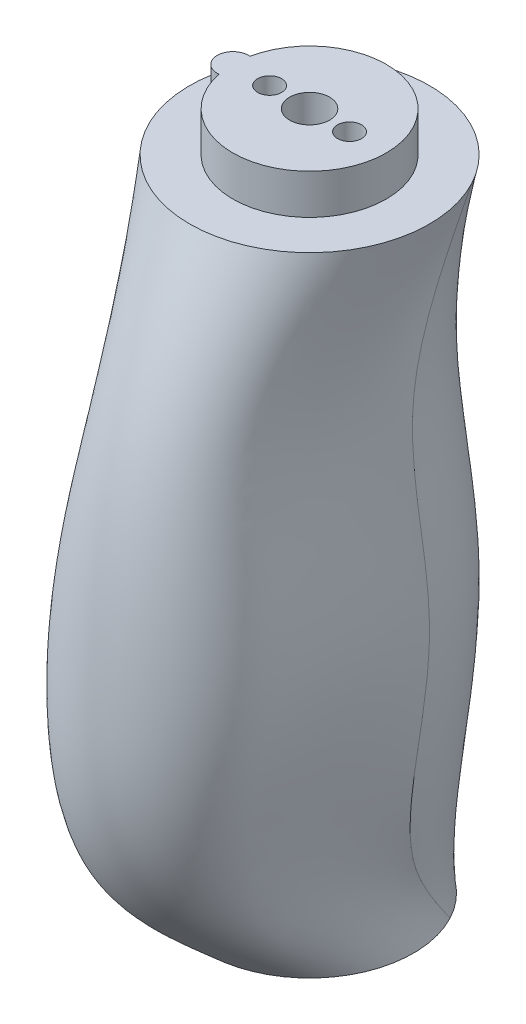
ISO-10303-21;
HEADER;
FILE_DESCRIPTION(('STEP AP214'),'2;1');
FILE_NAME('part.step','',(''),(''),'','','');
FILE_SCHEMA(('AUTOMOTIVE_DESIGN { 1 0 10303 214 1 1 1 1 }'));
ENDSEC;
DATA;
#1=APPLICATION_CONTEXT('core data for automotive mechanical design processes');
#2=APPLICATION_PROTOCOL_DEFINITION('international standard','automotive_design',2000,#1);
#3=PRODUCT_CONTEXT('',#1,'mechanical');
#4=PRODUCT('Part','Part','',(#3));
#5=PRODUCT_RELATED_PRODUCT_CATEGORY('part','',(#4));
#6=PRODUCT_DEFINITION_FORMATION('','',#4);
#7=PRODUCT_DEFINITION_CONTEXT('part definition',#1,'design');
#8=PRODUCT_DEFINITION('design','',#6,#7);
#9=PRODUCT_DEFINITION_SHAPE('','',#8);
#10=(LENGTH_UNIT() NAMED_UNIT(*) SI_UNIT(.MILLI.,.METRE.));
#11=(NAMED_UNIT(*) PLANE_ANGLE_UNIT() SI_UNIT($,.RADIAN.));
#12=(NAMED_UNIT(*) SI_UNIT($,.STERADIAN.) SOLID_ANGLE_UNIT());
#13=UNCERTAINTY_MEASURE_WITH_UNIT(LENGTH_MEASURE(1.E-05),#10,'distance_accuracy_value','');
#14=(GEOMETRIC_REPRESENTATION_CONTEXT(3) GLOBAL_UNCERTAINTY_ASSIGNED_CONTEXT((#13)) GLOBAL_UNIT_ASSIGNED_CONTEXT((#10,
#11,#12)) REPRESENTATION_CONTEXT('',''));
#15=CARTESIAN_POINT('',(0.,0.,0.));
#16=DIRECTION('',(0.,0.,1.));
#17=DIRECTION('',(1.,0.,0.));
#18=AXIS2_PLACEMENT_3D('',#15,#16,#17);
#19=CARTESIAN_POINT('',(0.,45.,0.));
#20=DIRECTION('',(0.,1.,0.));
#21=DIRECTION('',(0.,0.,1.));
#22=AXIS2_PLACEMENT_3D('',#19,#20,#21);
#23=PLANE('',#22);
#24=CARTESIAN_POINT('',(0.,45.,0.));
#25=DIRECTION('',(0.,1.,0.));
#26=DIRECTION('',(0.,0.,1.));
#27=AXIS2_PLACEMENT_3D('',#24,#25,#26);
#28=CIRCLE('',#27,9.6);
#29=CARTESIAN_POINT('',(-9.401953125,45.,1.93991686298736));
#30=VERTEX_POINT('',#29);
#31=CARTESIAN_POINT('',(-9.401953125,45.,-1.93991686298737));
#32=VERTEX_POINT('',#31);
#33=EDGE_CURVE('E187',#30,#32,#28,.T.);
#34=ORIENTED_EDGE('',*,*,#33,.F.);
#35=CARTESIAN_POINT('',(-9.6,45.,0.));
#36=DIRECTION('',(0.,1.,0.));
#37=DIRECTION('',(0.,0.,1.));
#38=AXIS2_PLACEMENT_3D('',#35,#36,#37);
#39=CIRCLE('',#38,1.95);
#40=EDGE_CURVE('E144',#32,#30,#39,.T.);
#41=ORIENTED_EDGE('',*,*,#40,.F.);
#42=EDGE_LOOP('',(#34,#41));
#43=FACE_BOUND('',#42,.T.);
#44=CARTESIAN_POINT('',(0.,45.,0.));
#45=DIRECTION('',(0.,1.,0.));
#46=DIRECTION('',(0.,0.,1.));
#47=AXIS2_PLACEMENT_3D('',#44,#45,#46);
#48=CIRCLE('',#47,15.);
#49=CARTESIAN_POINT('',(-13.2531843312214,45.,-7.02517651612167));
#50=VERTEX_POINT('',#49);
#51=CARTESIAN_POINT('',(13.2531843312214,45.,-7.02517651612168));
#52=VERTEX_POINT('',#51);
#53=EDGE_CURVE('E12',#50,#52,#48,.T.);
#54=ORIENTED_EDGE('',*,*,#53,.T.);
#55=EDGE_CURVE('E137',#52,#50,#48,.T.);
#56=ORIENTED_EDGE('',*,*,#55,.T.);
#57=EDGE_LOOP('',(#54,#56));
#58=FACE_BOUND('',#57,.T.);
#59=ADVANCED_FACE('F127',(#43,#58),#23,.T.);
#60=CARTESIAN_POINT('',(0.,-35.,0.));
#61=DIRECTION('',(0.,1.,0.));
#62=DIRECTION('',(0.,0.,1.));
#63=AXIS2_PLACEMENT_3D('',#60,#61,#62);
#64=PLANE('',#63);
#65=CARTESIAN_POINT('',(0.,-35.,0.));
#66=DIRECTION('',(0.,1.,0.));
#67=DIRECTION('',(0.,0.,1.));
#68=AXIS2_PLACEMENT_3D('',#65,#66,#67);
#69=CIRCLE('',#68,13.);
#70=CARTESIAN_POINT('',(11.4860930870586,-35.,-6.08848631397212));
#71=VERTEX_POINT('',#70);
#72=CARTESIAN_POINT('',(-11.4860930870586,-35.,-6.08848631397211));
#73=VERTEX_POINT('',#72);
#74=EDGE_CURVE('E191',#71,#73,#69,.T.);
#75=ORIENTED_EDGE('',*,*,#74,.F.);
#76=EDGE_CURVE('E188',#73,#71,#69,.T.);
#77=ORIENTED_EDGE('',*,*,#76,.F.);
#78=EDGE_LOOP('',(#75,#77));
#79=FACE_BOUND('',#78,.T.);
#80=ADVANCED_FACE('F216',(#79),#64,.F.);
#81=CARTESIAN_POINT('',(-11.4860930870586,-35.,-6.08848631397211));
#82=CARTESIAN_POINT('',(-11.9888238762296,-31.7784022579128,-3.68120735026925));
#83=CARTESIAN_POINT('',(-13.5455110165498,-21.8028449926401,3.77284218614079));
#84=CARTESIAN_POINT('',(-16.2480426834825,0.316696116781407,-1.95027484900687));
#85=CARTESIAN_POINT('',(-12.2634498571922,23.8453925764327,2.5589909201499));
#86=CARTESIAN_POINT('',(-12.9435296898292,38.3814345691434,-4.02661275139869));
#87=CARTESIAN_POINT('',(-13.2531843312214,45.,-7.02517651612167));
#88=CARTESIAN_POINT('',(-12.0757060436891,-35.,-4.97616562275975));
#89=CARTESIAN_POINT('',(-12.2371371110871,-31.7784022579128,-2.51903239271728));
#90=CARTESIAN_POINT('',(-12.7370023910334,-21.8028449926401,5.08938902019735));
#91=CARTESIAN_POINT('',(-16.3346657911776,0.316696116781407,-0.448570482043597));
#92=CARTESIAN_POINT('',(-11.630892938393,23.8453925764327,3.75867982403654));
#93=CARTESIAN_POINT('',(-13.2130964573224,38.3814345691434,-2.76937087706511));
#94=CARTESIAN_POINT('',(-13.9335069734874,45.,-5.74172956472279));
#95=CARTESIAN_POINT('',(-12.948395240104,-35.,-2.53751404419982));
#96=CARTESIAN_POINT('',(-12.5488443580324,-31.7784022579128,-0.0663093926603867));
#97=CARTESIAN_POINT('',(-11.3116499521554,-21.8028449926401,7.58568365215385));
#98=CARTESIAN_POINT('',(-16.4287996374814,0.316696116781411,2.49746817063417));
#99=CARTESIAN_POINT('',(-10.4940715288381,23.8453925764327,6.07807317078538));
#100=CARTESIAN_POINT('',(-13.5493318211742,38.3814345691434,-0.110234345279721));
#101=CARTESIAN_POINT('',(-14.9404560462738,45.,-2.92790082023056));
#102=CARTESIAN_POINT('',(-13.1202020575421,-35.,1.38058623727581));
#103=CARTESIAN_POINT('',(-12.3291410522181,-31.7784022579128,3.76921133479779));
#104=CARTESIAN_POINT('',(-9.87965015028428,-21.80284499264,11.1654998702377));
#105=CARTESIAN_POINT('',(-16.219428466563,0.316696116781407,6.90927809821799));
#106=CARTESIAN_POINT('',(-9.26650845603646,23.8453925764326,9.45461916506622));
#107=CARTESIAN_POINT('',(-13.3014850385526,38.3814345691434,4.05262541215436));
#108=CARTESIAN_POINT('',(-15.1386946817794,45.0000000000001,1.59298411993362));
#109=CARTESIAN_POINT('',(-12.1526333497857,-35.,5.10186225458553));
#110=CARTESIAN_POINT('',(-11.4198418088333,-31.7784022579128,7.48784397983032));
#111=CARTESIAN_POINT('',(-9.15078013028185,-21.8028449926401,14.8759474115932));
#112=CARTESIAN_POINT('',(-15.6209743761056,0.316696116781415,11.4180176403135));
#113=CARTESIAN_POINT('',(-8.51785375415218,23.8453925764327,12.9042246773368));
#114=CARTESIAN_POINT('',(-12.3001227032908,38.3814345691434,8.08229161037576));
#115=CARTESIAN_POINT('',(-14.0222692497527,45.,5.88676413990638));
#116=CARTESIAN_POINT('',(-10.887357209312,-35.,7.2008252898483));
#117=CARTESIAN_POINT('',(-10.4375658061361,-31.7784022579128,9.73876470084562));
#118=CARTESIAN_POINT('',(-9.04480350028048,-21.8028449926401,17.5973994395807));
#119=CARTESIAN_POINT('',(-14.9766133635883,0.316696116781407,14.6100968458733));
#120=CARTESIAN_POINT('',(-8.28058585549539,23.8453925764327,15.3408772920504));
#121=CARTESIAN_POINT('',(-11.222719813892,38.3814345691434,10.5087937570946));
#122=CARTESIAN_POINT('',(-12.5623352415138,45.,8.30864456520958));
#123=CARTESIAN_POINT('',(-9.52001882863477,-35.,8.91024351324858));
#124=CARTESIAN_POINT('',(-9.40844097690152,-31.7784022579128,11.6846223075834));
#125=CARTESIAN_POINT('',(-9.06294432008427,-21.8028449926401,20.275382779285));
#126=CARTESIAN_POINT('',(-14.2648353782855,0.316696116781407,17.837200103447));
#127=CARTESIAN_POINT('',(-8.1443715269184,23.8453925764327,17.6694002567649));
#128=CARTESIAN_POINT('',(-10.0960135006473,38.3814345691434,12.5926165367351));
#129=CARTESIAN_POINT('',(-10.9846371099632,45.,10.2810502075945));
#130=CARTESIAN_POINT('',(-8.09358650755049,-35.,10.3149794767972));
#131=CARTESIAN_POINT('',(-8.2150129940882,-31.7784022579129,13.3458935222121));
#132=CARTESIAN_POINT('',(-8.5910055812922,-21.8028449926401,22.7310058319096));
#133=CARTESIAN_POINT('',(-13.1293598592967,0.316696116781404,20.8244046872586));
#134=CARTESIAN_POINT('',(-7.60652900077011,23.8453925764328,19.7741673405866));
#135=CARTESIAN_POINT('',(-8.79679880443047,38.3814345691434,14.3648673651839));
#136=CARTESIAN_POINT('',(-9.33875366255825,45.,11.9018993963044));
#137=CARTESIAN_POINT('',(-5.59203518305619,-35.,11.855952732266));
#138=CARTESIAN_POINT('',(-5.82898167812688,-31.7784022579129,15.2622568540078));
#139=CARTESIAN_POINT('',(-6.56267766366352,-21.8028449926399,25.8097505356229));
#140=CARTESIAN_POINT('',(-9.89329949169413,0.316696116781386,24.7478818567327));
#141=CARTESIAN_POINT('',(-5.72616000602117,23.8453925764326,22.3566075099813));
#142=CARTESIAN_POINT('',(-6.22514838959946,38.3814345691434,16.3945813004986));
#143=CARTESIAN_POINT('',(-6.45234828814175,45.,13.6799454603069));
#144=CARTESIAN_POINT('',(-2.85491084493486,-35.,12.7899670514318));
#145=CARTESIAN_POINT('',(-3.02337616970725,-31.7784022579128,16.4659575188415));
#146=CARTESIAN_POINT('',(-3.54502276528469,-21.80284499264,27.8485249123998));
#147=CARTESIAN_POINT('',(-5.3344817453263,0.316696116781405,27.4569473453695));
#148=CARTESIAN_POINT('',(-3.06633425484551,23.8453925764327,24.0401267777755));
#149=CARTESIAN_POINT('',(-3.22285892563202,38.3814345691434,17.6618278486015));
#150=CARTESIAN_POINT('',(-3.29412789800175,45.,14.7576542901136));
#151=CARTESIAN_POINT('',(0.,-35.,13.105234476939));
#152=CARTESIAN_POINT('',(0.,-31.7784022579128,16.877820595253));
#153=CARTESIAN_POINT('',(0.,-21.8028449926401,28.5594928194932));
#154=CARTESIAN_POINT('',(0.,0.316696116781421,28.4285412356542));
#155=CARTESIAN_POINT('',(0.,23.8453925764327,24.6225282855279));
#156=CARTESIAN_POINT('',(0.,38.3814345691434,18.0940003699202));
#157=CARTESIAN_POINT('',(0.,45.,15.121424396468));
#158=CARTESIAN_POINT('',(2.85491084493484,-35.,12.7899670514318));
#159=CARTESIAN_POINT('',(3.02337616970723,-31.7784022579128,16.4659575188415));
#160=CARTESIAN_POINT('',(3.54502276528469,-21.80284499264,27.8485249123997));
#161=CARTESIAN_POINT('',(5.33448174532625,0.316696116781404,27.4569473453696));
#162=CARTESIAN_POINT('',(3.0663342548455,23.8453925764327,24.0401267777754));
#163=CARTESIAN_POINT('',(3.22285892563201,38.3814345691434,17.6618278486015));
#164=CARTESIAN_POINT('',(3.29412789800174,45.,14.7576542901136));
#165=CARTESIAN_POINT('',(5.59203518305618,-35.,11.855952732266));
#166=CARTESIAN_POINT('',(5.82898167812687,-31.7784022579129,15.2622568540078));
#167=CARTESIAN_POINT('',(6.56267766366354,-21.8028449926401,25.8097505356229));
#168=CARTESIAN_POINT('',(9.89329949169404,0.316696116781398,24.7478818567327));
#169=CARTESIAN_POINT('',(5.72616000602118,23.8453925764327,22.3566075099814));
#170=CARTESIAN_POINT('',(6.22514838959946,38.3814345691434,16.3945813004986));
#171=CARTESIAN_POINT('',(6.45234828814174,44.9999999999999,13.6799454603069));
#172=CARTESIAN_POINT('',(8.09358650755047,-35.,10.3149794767972));
#173=CARTESIAN_POINT('',(8.2150129940882,-31.7784022579129,13.3458935222121));
#174=CARTESIAN_POINT('',(8.59100558129222,-21.80284499264,22.7310058319096));
#175=CARTESIAN_POINT('',(13.1293598592967,0.316696116781401,20.8244046872587));
#176=CARTESIAN_POINT('',(7.60652900077013,23.8453925764327,19.7741673405866));
#177=CARTESIAN_POINT('',(8.79679880443047,38.3814345691434,14.3648673651839));
#178=CARTESIAN_POINT('',(9.33875366255824,45.,11.9018993963044));
#179=CARTESIAN_POINT('',(9.52001882863476,-35.,8.91024351324859));
#180=CARTESIAN_POINT('',(9.40844097690152,-31.7784022579128,11.6846223075834));
#181=CARTESIAN_POINT('',(9.06294432008428,-21.8028449926401,20.275382779285));
#182=CARTESIAN_POINT('',(14.2648353782855,0.316696116781405,17.8372001034471));
#183=CARTESIAN_POINT('',(8.14437152691841,23.8453925764327,17.6694002567648));
#184=CARTESIAN_POINT('',(10.0960135006473,38.3814345691434,12.5926165367351));
#185=CARTESIAN_POINT('',(10.9846371099632,45.,10.2810502075945));
#186=CARTESIAN_POINT('',(10.887357209312,-35.,7.20082528984831));
#187=CARTESIAN_POINT('',(10.4375658061347,-31.7784022579128,9.73876470084729));
#188=CARTESIAN_POINT('',(9.04480350027502,-21.8028449926401,17.5973994395875));
#189=CARTESIAN_POINT('',(14.9766133636402,0.316696116781405,14.6100968458083));
#190=CARTESIAN_POINT('',(8.28058585531833,23.8453925764327,15.3408772922717));
#191=CARTESIAN_POINT('',(11.2227198142082,38.3814345691434,10.5087937566993));
#192=CARTESIAN_POINT('',(12.5623352420546,45.,8.30864456453352));
#193=CARTESIAN_POINT('',(12.1526333497857,-35.,5.10186225458554));
#194=CARTESIAN_POINT('',(11.4198418088344,-31.7784022579128,7.48784397982955));
#195=CARTESIAN_POINT('',(9.15078013028652,-21.8028449926401,14.87594741159));
#196=CARTESIAN_POINT('',(15.6209743760612,0.316696116781411,11.4180176403439));
#197=CARTESIAN_POINT('',(8.51785375430321,23.8453925764327,12.904224677233));
#198=CARTESIAN_POINT('',(12.3001227030211,38.3814345691434,8.08229161056118));
#199=CARTESIAN_POINT('',(14.0222692492915,45.,5.8867641402235));
#200=CARTESIAN_POINT('',(13.1202020575421,-35.,1.38058623727581));
#201=CARTESIAN_POINT('',(12.3291410522173,-31.7784022579129,3.76921133479765));
#202=CARTESIAN_POINT('',(9.8796501502809,-21.80284499264,11.1654998702371));
#203=CARTESIAN_POINT('',(16.2194284665952,0.316696116781399,6.90927809822333));
#204=CARTESIAN_POINT('',(9.26650845592629,23.8453925764327,9.45461916504786));
#205=CARTESIAN_POINT('',(13.3014850387494,38.3814345691434,4.05262541218713));
#206=CARTESIAN_POINT('',(15.138694682116,45.,1.59298411998968));
#207=CARTESIAN_POINT('',(12.948395240104,-35.,-2.53751404419982));
#208=CARTESIAN_POINT('',(12.5488443580334,-31.7784022579128,-0.0663093926592501));
#209=CARTESIAN_POINT('',(11.3116499521595,-21.8028449926401,7.5856836521585));
#210=CARTESIAN_POINT('',(16.4287996374423,0.316696116781418,2.49746817059016));
#211=CARTESIAN_POINT('',(10.4940715289713,23.8453925764327,6.07807317093477));
#212=CARTESIAN_POINT('',(13.5493318209364,38.3814345691434,-0.11023434554634));
#213=CARTESIAN_POINT('',(14.9404560458671,45.,-2.9279008206866));
#214=CARTESIAN_POINT('',(12.0757060436891,-35.,-4.97616562275976));
#215=CARTESIAN_POINT('',(12.237137111086,-31.7784022579128,-2.5190323927193));
#216=CARTESIAN_POINT('',(12.7370023910291,-21.8028449926401,5.0893890201891));
#217=CARTESIAN_POINT('',(16.3346657912193,0.316696116781405,-0.448570481965158));
#218=CARTESIAN_POINT('',(11.630892938251,23.8453925764327,3.75867982376876));
#219=CARTESIAN_POINT('',(13.2130964575759,38.3814345691434,-2.76937087658692));
#220=CARTESIAN_POINT('',(13.933506973921,45.,-5.74172956390495));
#221=CARTESIAN_POINT('',(11.4860930870586,-35.,-6.08848631397212));
#222=CARTESIAN_POINT('',(11.9888238762296,-31.7784022579128,-3.68120735026925));
#223=CARTESIAN_POINT('',(13.5455110165498,-21.8028449926401,3.77284218614081));
#224=CARTESIAN_POINT('',(16.2480426834825,0.316696116781407,-1.95027484900705));
#225=CARTESIAN_POINT('',(12.2634498571922,23.8453925764327,2.55899092014994));
#226=CARTESIAN_POINT('',(12.9435296898292,38.3814345691434,-4.02661275139869));
#227=CARTESIAN_POINT('',(13.2531843312214,45.,-7.02517651612168));
#228=B_SPLINE_SURFACE_WITH_KNOTS('',3,3,((#81,#82,#83,#84,#85,#86,#87),(#88,#89,#90,#91,#92,#93,
#94),(#95,#96,#97,#98,#99,#100,#101),(#102,#103,#104,#105,#106,#107,#108),(#109,#110,#111,#112,
#113,#114,#115),(#116,#117,#118,#119,#120,#121,#122),(#123,#124,#125,#126,#127,#128,#129),(#130,
#131,#132,#133,#134,#135,#136),(#137,#138,#139,#140,#141,#142,#143),(#144,#145,#146,#147,#148,
#149,#150),(#151,#152,#153,#154,#155,#156,#157),(#158,#159,#160,#161,#162,#163,#164),(#165,#166,
#167,#168,#169,#170,#171),(#172,#173,#174,#175,#176,#177,#178),(#179,#180,#181,#182,#183,#184,
#185),(#186,#187,#188,#189,#190,#191,#192),(#193,#194,#195,#196,#197,#198,#199),(#200,#201,#202,
#203,#204,#205,#206),(#207,#208,#209,#210,#211,#212,#213),(#214,#215,#216,#217,#218,#219,#220),
(#221,#222,#223,#224,#225,#226,#227)),.UNSPECIFIED.,.F.,.F.,.F.,(4,1,1,1,2,1,1,1,1,1,1,1,2,1,1,
1,4),(4,1,1,1,4),(0.,0.0672377758350363,0.134475551670073,0.201713327505109,0.268951103340145,
0.326713327505109,0.384475551670073,0.442237775835036,0.5,0.557762224164963,0.615524448329927,
0.673286672494891,0.731048896659854,0.798286672494891,0.865524448329927,0.932762224164964,1.),
(0.,0.143979143268855,0.445826047715341,0.747672952161826,1.),.UNSPECIFIED.);
#229=CARTESIAN_POINT('',(11.4860930870586,-35.,-6.08848631397212));
#230=CARTESIAN_POINT('',(11.9888238762296,-31.7784022579128,-3.68120735026925));
#231=CARTESIAN_POINT('',(13.5455110165498,-21.8028449926401,3.77284218614081));
#232=CARTESIAN_POINT('',(16.2480426834825,0.316696116781407,-1.95027484900705));
#233=CARTESIAN_POINT('',(12.2634498571922,23.8453925764327,2.55899092014994));
#234=CARTESIAN_POINT('',(12.9435296898292,38.3814345691434,-4.02661275139869));
#235=CARTESIAN_POINT('',(13.2531843312214,45.,-7.02517651612168));
#236=B_SPLINE_CURVE_WITH_KNOTS('',3,(#229,#230,#231,#232,#233,#234,#235),.UNSPECIFIED.,.F.,.F.,
(4,1,1,1,4),(0.,0.143979143268855,0.445826047715341,0.747672952161826,1.),.UNSPECIFIED.);
#237=EDGE_CURVE('E267',#71,#52,#236,.T.);
#238=CARTESIAN_POINT('',(-11.4860930870586,-35.,-6.08848631397211));
#239=CARTESIAN_POINT('',(-11.9888238762296,-31.7784022579128,-3.68120735026925));
#240=CARTESIAN_POINT('',(-13.5455110165498,-21.8028449926401,3.77284218614079));
#241=CARTESIAN_POINT('',(-16.2480426834825,0.316696116781407,-1.95027484900687));
#242=CARTESIAN_POINT('',(-12.2634498571922,23.8453925764327,2.5589909201499));
#243=CARTESIAN_POINT('',(-12.9435296898292,38.3814345691434,-4.02661275139869));
#244=CARTESIAN_POINT('',(-13.2531843312214,45.,-7.02517651612167));
#245=B_SPLINE_CURVE_WITH_KNOTS('',3,(#238,#239,#240,#241,#242,#243,#244),.UNSPECIFIED.,.F.,.F.,
(4,1,1,1,4),(0.,0.143979143268855,0.445826047715341,0.747672952161826,1.),.UNSPECIFIED.);
#246=EDGE_CURVE('E206',#50,#73,#245,.F.);
#247=CARTESIAN_POINT('',(-11.4860794694607,-35.0000872642447,-6.08855152055513));
#248=CARTESIAN_POINT('',(-11.48608400866,-35.0000581761632,-6.08852978502746));
#249=CARTESIAN_POINT('',(-11.4860885478593,-35.0000290880816,-6.08850804949978));
#250=CARTESIAN_POINT('',(-11.4860930870586,-35.,-6.08848631397211));
#251=CARTESIAN_POINT('',(-11.9888238762296,-31.7784022579128,-3.68120735026925));
#252=CARTESIAN_POINT('',(-13.5455110165498,-21.8028449926401,3.77284218614079));
#253=CARTESIAN_POINT('',(-16.2480426834825,0.316696116781407,-1.95027484900687));
#254=CARTESIAN_POINT('',(-12.2634498571922,23.8453925764327,2.5589909201499));
#255=CARTESIAN_POINT('',(-12.9435296898292,38.3814345691434,-4.02661275139869));
#256=CARTESIAN_POINT('',(-13.2531843312214,45.,-7.02517651612167));
#257=CARTESIAN_POINT('',(-12.0757016709644,-35.0000872642447,-4.97623217975807));
#258=CARTESIAN_POINT('',(-12.0757031285393,-35.0000581761632,-4.97620999409197));
#259=CARTESIAN_POINT('',(-12.0757045861142,-35.0000290880816,-4.97618780842586));
#260=CARTESIAN_POINT('',(-12.0757060436891,-35.,-4.97616562275975));
#261=CARTESIAN_POINT('',(-12.2371371110871,-31.7784022579128,-2.51903239271728));
#262=CARTESIAN_POINT('',(-12.7370023910334,-21.8028449926401,5.08938902019735));
#263=CARTESIAN_POINT('',(-16.3346657911776,0.316696116781407,-0.448570482043597));
#264=CARTESIAN_POINT('',(-11.630892938393,23.8453925764327,3.75867982403654));
#265=CARTESIAN_POINT('',(-13.2130964573224,38.3814345691434,-2.76937087706511));
#266=CARTESIAN_POINT('',(-13.9335069734874,45.,-5.74172956472279));
#267=CARTESIAN_POINT('',(-12.9484060628413,-35.0000872642447,-2.53758098235435));
#268=CARTESIAN_POINT('',(-12.9484024552622,-35.0000581761631,-2.53755866963618));
#269=CARTESIAN_POINT('',(-12.9483988476831,-35.0000290880816,-2.537536356918));
#270=CARTESIAN_POINT('',(-12.948395240104,-35.,-2.53751404419982));
#271=CARTESIAN_POINT('',(-12.5488443580324,-31.7784022579128,-0.0663093926603867));
#272=CARTESIAN_POINT('',(-11.3116499521554,-21.8028449926401,7.58568365215385));
#273=CARTESIAN_POINT('',(-16.4287996374814,0.316696116781411,2.49746817063417));
#274=CARTESIAN_POINT('',(-10.4940715288381,23.8453925764327,6.07807317078538));
#275=CARTESIAN_POINT('',(-13.5493318211742,38.3814345691434,-0.110234345279721));
#276=CARTESIAN_POINT('',(-14.9404560462738,45.,-2.92790082023056));
#277=CARTESIAN_POINT('',(-13.1202234852145,-35.0000872642447,1.38052153597485));
#278=CARTESIAN_POINT('',(-13.120216342657,-35.0000581761632,1.38054310307517));
#279=CARTESIAN_POINT('',(-13.1202092000996,-35.0000290880816,1.38056467017549));
#280=CARTESIAN_POINT('',(-13.1202020575421,-35.,1.38058623727581));
#281=CARTESIAN_POINT('',(-12.3291410522181,-31.7784022579128,3.76921133479779));
#282=CARTESIAN_POINT('',(-9.87965015028428,-21.80284499264,11.1654998702377));
#283=CARTESIAN_POINT('',(-16.219428466563,0.316696116781407,6.90927809821799));
#284=CARTESIAN_POINT('',(-9.26650845603646,23.8453925764326,9.45461916506622));
#285=CARTESIAN_POINT('',(-13.3014850385526,38.3814345691434,4.05262541215436));
#286=CARTESIAN_POINT('',(-15.1386946817794,45.0000000000001,1.59298411993362));
#287=CARTESIAN_POINT('',(-12.1526531990982,-35.0000872642447,5.10179762488627));
#288=CARTESIAN_POINT('',(-12.1526465826607,-35.0000581761631,5.10181916811936));
#289=CARTESIAN_POINT('',(-12.1526399662232,-35.0000290880815,5.10184071135244));
#290=CARTESIAN_POINT('',(-12.1526333497857,-35.,5.10186225458553));
#291=CARTESIAN_POINT('',(-11.4198418088333,-31.7784022579128,7.48784397983032));
#292=CARTESIAN_POINT('',(-9.15078013028185,-21.8028449926401,14.8759474115932));
#293=CARTESIAN_POINT('',(-15.6209743761056,0.316696116781415,11.4180176403135));
#294=CARTESIAN_POINT('',(-8.51785375415218,23.8453925764327,12.9042246773368));
#295=CARTESIAN_POINT('',(-12.3001227032908,38.3814345691434,8.08229161037576));
#296=CARTESIAN_POINT('',(-14.0222692497527,45.,5.88676413990638));
#297=CARTESIAN_POINT('',(-10.8873693929271,-35.0000872642447,7.20075654403222));
#298=CARTESIAN_POINT('',(-10.8873653317221,-35.0000581761631,7.20077945930424));
#299=CARTESIAN_POINT('',(-10.887361270517,-35.0000290880816,7.20080237457627));
#300=CARTESIAN_POINT('',(-10.887357209312,-35.,7.2008252898483));
#301=CARTESIAN_POINT('',(-10.4375658061361,-31.7784022579128,9.73876470084562));
#302=CARTESIAN_POINT('',(-9.04480350028048,-21.8028449926401,17.5973994395807));
#303=CARTESIAN_POINT('',(-14.9766133635883,0.316696116781407,14.6100968458733));
#304=CARTESIAN_POINT('',(-8.28058585549539,23.8453925764327,15.3408772920504));
#305=CARTESIAN_POINT('',(-11.222719813892,38.3814345691434,10.5087937570946));
#306=CARTESIAN_POINT('',(-12.5623352415138,45.,8.30864456520958));
#307=CARTESIAN_POINT('',(-9.52002185097268,-35.0000872642447,8.91016836293825));
#308=CARTESIAN_POINT('',(-9.52002084352671,-35.0000581761632,8.91019341304169));
#309=CARTESIAN_POINT('',(-9.52001983608074,-35.0000290880816,8.91021846314514));
#310=CARTESIAN_POINT('',(-9.52001882863477,-35.,8.91024351324858));
#311=CARTESIAN_POINT('',(-9.40844097690152,-31.7784022579128,11.6846223075834));
#312=CARTESIAN_POINT('',(-9.06294432008427,-21.8028449926401,20.275382779285));
#313=CARTESIAN_POINT('',(-14.2648353782855,0.316696116781407,17.837200103447));
#314=CARTESIAN_POINT('',(-8.1443715269184,23.8453925764327,17.6694002567649));
#315=CARTESIAN_POINT('',(-10.0960135006473,38.3814345691434,12.5926165367351));
#316=CARTESIAN_POINT('',(-10.9846371099632,45.,10.2810502075945));
#317=CARTESIAN_POINT('',(-8.09358321844008,-35.0000872642447,10.3148973776507));
#318=CARTESIAN_POINT('',(-8.09358431481022,-35.0000581761632,10.3149247440328));
#319=CARTESIAN_POINT('',(-8.09358541118035,-35.0000290880816,10.314952110415));
#320=CARTESIAN_POINT('',(-8.09358650755049,-35.,10.3149794767972));
#321=CARTESIAN_POINT('',(-8.2150129940882,-31.7784022579129,13.3458935222121));
#322=CARTESIAN_POINT('',(-8.5910055812922,-21.8028449926401,22.7310058319096));
#323=CARTESIAN_POINT('',(-13.1293598592967,0.316696116781404,20.8244046872586));
#324=CARTESIAN_POINT('',(-7.60652900077011,23.8453925764328,19.7741673405866));
#325=CARTESIAN_POINT('',(-8.79679880443047,38.3814345691434,14.3648673651839));
#326=CARTESIAN_POINT('',(-9.33875366255825,45.,11.9018993963044));
#327=CARTESIAN_POINT('',(-5.59202876482568,-35.0000872642448,11.8558604648322));
#328=CARTESIAN_POINT('',(-5.59203090423585,-35.0000581761632,11.8558912206434));
#329=CARTESIAN_POINT('',(-5.59203304364602,-35.0000290880816,11.8559219764547));
#330=CARTESIAN_POINT('',(-5.59203518305619,-35.,11.855952732266));
#331=CARTESIAN_POINT('',(-5.82898167812688,-31.7784022579129,15.2622568540078));
#332=CARTESIAN_POINT('',(-6.56267766366352,-21.8028449926399,25.8097505356229));
#333=CARTESIAN_POINT('',(-9.89329949169413,0.316696116781386,24.7478818567327));
#334=CARTESIAN_POINT('',(-5.72616000602117,23.8453925764326,22.3566075099813));
#335=CARTESIAN_POINT('',(-6.22514838959946,38.3814345691434,16.3945813004986));
#336=CARTESIAN_POINT('',(-6.45234828814175,45.,13.6799454603069));
#337=CARTESIAN_POINT('',(-2.85490628167138,-35.0000872642447,12.7898674789347));
#338=CARTESIAN_POINT('',(-2.85490780275921,-35.0000581761632,12.7899006697671));
#339=CARTESIAN_POINT('',(-2.85490932384704,-35.0000290880816,12.7899338605995));
#340=CARTESIAN_POINT('',(-2.85491084493486,-35.,12.7899670514318));
#341=CARTESIAN_POINT('',(-3.02337616970725,-31.7784022579128,16.4659575188415));
#342=CARTESIAN_POINT('',(-3.54502276528469,-21.80284499264,27.8485249123998));
#343=CARTESIAN_POINT('',(-5.3344817453263,0.316696116781405,27.4569473453695));
#344=CARTESIAN_POINT('',(-3.06633425484551,23.8453925764327,24.0401267777755));
#345=CARTESIAN_POINT('',(-3.22285892563202,38.3814345691434,17.6618278486015));
#346=CARTESIAN_POINT('',(-3.29412789800175,45.,14.7576542901136));
#347=CARTESIAN_POINT('',(0.,-35.0000872642447,13.1051322879307));
#348=CARTESIAN_POINT('',(0.,-35.0000581761631,13.1051663509335));
#349=CARTESIAN_POINT('',(0.,-35.0000290880815,13.1052004139362));
#350=CARTESIAN_POINT('',(0.,-35.,13.105234476939));
#351=CARTESIAN_POINT('',(0.,-31.7784022579128,16.877820595253));
#352=CARTESIAN_POINT('',(0.,-21.8028449926401,28.5594928194932));
#353=CARTESIAN_POINT('',(0.,0.316696116781421,28.4285412356542));
#354=CARTESIAN_POINT('',(0.,23.8453925764327,24.6225282855279));
#355=CARTESIAN_POINT('',(0.,38.3814345691434,18.0940003699202));
#356=CARTESIAN_POINT('',(0.,45.,15.121424396468));
#357=CARTESIAN_POINT('',(2.85490628167136,-35.0000872642447,12.7898674789347));
#358=CARTESIAN_POINT('',(2.85490780275919,-35.0000581761631,12.7899006697671));
#359=CARTESIAN_POINT('',(2.85490932384701,-35.0000290880816,12.7899338605995));
#360=CARTESIAN_POINT('',(2.85491084493484,-35.,12.7899670514318));
#361=CARTESIAN_POINT('',(3.02337616970723,-31.7784022579128,16.4659575188415));
#362=CARTESIAN_POINT('',(3.54502276528469,-21.80284499264,27.8485249123997));
#363=CARTESIAN_POINT('',(5.33448174532625,0.316696116781404,27.4569473453696));
#364=CARTESIAN_POINT('',(3.0663342548455,23.8453925764327,24.0401267777754));
#365=CARTESIAN_POINT('',(3.22285892563201,38.3814345691434,17.6618278486015));
#366=CARTESIAN_POINT('',(3.29412789800174,45.,14.7576542901136));
#367=CARTESIAN_POINT('',(5.59202876482566,-35.0000872642447,11.8558604648322));
#368=CARTESIAN_POINT('',(5.59203090423584,-35.0000581761632,11.8558912206435));
#369=CARTESIAN_POINT('',(5.59203304364601,-35.0000290880816,11.8559219764547));
#370=CARTESIAN_POINT('',(5.59203518305618,-35.,11.855952732266));
#371=CARTESIAN_POINT('',(5.82898167812687,-31.7784022579129,15.2622568540078));
#372=CARTESIAN_POINT('',(6.56267766366354,-21.8028449926401,25.8097505356229));
#373=CARTESIAN_POINT('',(9.89329949169404,0.316696116781398,24.7478818567327));
#374=CARTESIAN_POINT('',(5.72616000602118,23.8453925764327,22.3566075099814));
#375=CARTESIAN_POINT('',(6.22514838959946,38.3814345691434,16.3945813004986));
#376=CARTESIAN_POINT('',(6.45234828814174,44.9999999999999,13.6799454603069));
#377=CARTESIAN_POINT('',(8.09358321844008,-35.0000872642447,10.3148973776507));
#378=CARTESIAN_POINT('',(8.09358431481021,-35.0000581761632,10.3149247440328));
#379=CARTESIAN_POINT('',(8.09358541118034,-35.0000290880816,10.314952110415));
#380=CARTESIAN_POINT('',(8.09358650755047,-35.,10.3149794767972));
#381=CARTESIAN_POINT('',(8.2150129940882,-31.7784022579129,13.3458935222121));
#382=CARTESIAN_POINT('',(8.59100558129222,-21.80284499264,22.7310058319096));
#383=CARTESIAN_POINT('',(13.1293598592967,0.316696116781401,20.8244046872587));
#384=CARTESIAN_POINT('',(7.60652900077013,23.8453925764327,19.7741673405866));
#385=CARTESIAN_POINT('',(8.79679880443047,38.3814345691434,14.3648673651839));
#386=CARTESIAN_POINT('',(9.33875366255824,45.,11.9018993963044));
#387=CARTESIAN_POINT('',(9.52002185097267,-35.0000872642447,8.91016836293826));
#388=CARTESIAN_POINT('',(9.5200208435267,-35.0000581761632,8.9101934130417));
#389=CARTESIAN_POINT('',(9.52001983608073,-35.0000290880816,8.91021846314514));
#390=CARTESIAN_POINT('',(9.52001882863476,-35.,8.91024351324859));
#391=CARTESIAN_POINT('',(9.40844097690152,-31.7784022579128,11.6846223075834));
#392=CARTESIAN_POINT('',(9.06294432008428,-21.8028449926401,20.275382779285));
#393=CARTESIAN_POINT('',(14.2648353782855,0.316696116781405,17.8372001034471));
#394=CARTESIAN_POINT('',(8.14437152691841,23.8453925764327,17.6694002567648));
#395=CARTESIAN_POINT('',(10.0960135006473,38.3814345691434,12.5926165367351));
#396=CARTESIAN_POINT('',(10.9846371099632,45.,10.2810502075945));
#397=CARTESIAN_POINT('',(10.8873693929271,-35.0000872642447,7.20075654403223));
#398=CARTESIAN_POINT('',(10.8873653317221,-35.0000581761632,7.20077945930425));
#399=CARTESIAN_POINT('',(10.887361270517,-35.0000290880816,7.20080237457628));
#400=CARTESIAN_POINT('',(10.887357209312,-35.,7.20082528984831));
#401=CARTESIAN_POINT('',(10.4375658061347,-31.7784022579128,9.73876470084729));
#402=CARTESIAN_POINT('',(9.04480350027502,-21.8028449926401,17.5973994395875));
#403=CARTESIAN_POINT('',(14.9766133636402,0.316696116781405,14.6100968458083));
#404=CARTESIAN_POINT('',(8.28058585531833,23.8453925764327,15.3408772922717));
#405=CARTESIAN_POINT('',(11.2227198142082,38.3814345691434,10.5087937566993));
#406=CARTESIAN_POINT('',(12.5623352420546,45.,8.30864456453352));
#407=CARTESIAN_POINT('',(12.1526531990982,-35.0000872642447,5.10179762488628));
#408=CARTESIAN_POINT('',(12.1526465826607,-35.0000581761631,5.10181916811937));
#409=CARTESIAN_POINT('',(12.1526399662232,-35.0000290880816,5.10184071135245));
#410=CARTESIAN_POINT('',(12.1526333497857,-35.,5.10186225458554));
#411=CARTESIAN_POINT('',(11.4198418088344,-31.7784022579128,7.48784397982955));
#412=CARTESIAN_POINT('',(9.15078013028652,-21.8028449926401,14.87594741159));
#413=CARTESIAN_POINT('',(15.6209743760612,0.316696116781411,11.4180176403439));
#414=CARTESIAN_POINT('',(8.51785375430321,23.8453925764327,12.904224677233));
#415=CARTESIAN_POINT('',(12.3001227030211,38.3814345691434,8.08229161056118));
#416=CARTESIAN_POINT('',(14.0222692492915,45.,5.8867641402235));
#417=CARTESIAN_POINT('',(13.1202234852145,-35.0000872642448,1.38052153597485));
#418=CARTESIAN_POINT('',(13.1202163426571,-35.0000581761632,1.38054310307517));
#419=CARTESIAN_POINT('',(13.1202092000996,-35.0000290880816,1.38056467017549));
#420=CARTESIAN_POINT('',(13.1202020575421,-35.,1.38058623727581));
#421=CARTESIAN_POINT('',(12.3291410522173,-31.7784022579129,3.76921133479765));
#422=CARTESIAN_POINT('',(9.8796501502809,-21.80284499264,11.1654998702371));
#423=CARTESIAN_POINT('',(16.2194284665952,0.316696116781399,6.90927809822333));
#424=CARTESIAN_POINT('',(9.26650845592629,23.8453925764327,9.45461916504786));
#425=CARTESIAN_POINT('',(13.3014850387494,38.3814345691434,4.05262541218713));
#426=CARTESIAN_POINT('',(15.138694682116,45.,1.59298411998968));
#427=CARTESIAN_POINT('',(12.9484060628413,-35.0000872642447,-2.53758098235435));
#428=CARTESIAN_POINT('',(12.9484024552622,-35.0000581761631,-2.53755866963618));
#429=CARTESIAN_POINT('',(12.9483988476831,-35.0000290880815,-2.537536356918));
#430=CARTESIAN_POINT('',(12.948395240104,-35.,-2.53751404419982));
#431=CARTESIAN_POINT('',(12.5488443580334,-31.7784022579128,-0.0663093926592501));
#432=CARTESIAN_POINT('',(11.3116499521595,-21.8028449926401,7.5856836521585));
#433=CARTESIAN_POINT('',(16.4287996374423,0.316696116781418,2.49746817059016));
#434=CARTESIAN_POINT('',(10.4940715289713,23.8453925764327,6.07807317093477));
#435=CARTESIAN_POINT('',(13.5493318209364,38.3814345691434,-0.11023434554634));
#436=CARTESIAN_POINT('',(14.9404560458671,45.,-2.9279008206866));
#437=CARTESIAN_POINT('',(12.0757016709644,-35.0000872642447,-4.97623217975808));
#438=CARTESIAN_POINT('',(12.0757031285393,-35.0000581761632,-4.97620999409197));
#439=CARTESIAN_POINT('',(12.0757045861142,-35.0000290880816,-4.97618780842587));
#440=CARTESIAN_POINT('',(12.0757060436891,-35.,-4.97616562275976));
#441=CARTESIAN_POINT('',(12.237137111086,-31.7784022579128,-2.5190323927193));
#442=CARTESIAN_POINT('',(12.7370023910291,-21.8028449926401,5.0893890201891));
#443=CARTESIAN_POINT('',(16.3346657912193,0.316696116781405,-0.448570481965158));
#444=CARTESIAN_POINT('',(11.630892938251,23.8453925764327,3.75867982376876));
#445=CARTESIAN_POINT('',(13.2130964575759,38.3814345691434,-2.76937087658692));
#446=CARTESIAN_POINT('',(13.933506973921,45.,-5.74172956390495));
#447=CARTESIAN_POINT('',(11.4860794694607,-35.0000872642447,-6.08855152055514));
#448=CARTESIAN_POINT('',(11.48608400866,-35.0000581761632,-6.08852978502746));
#449=CARTESIAN_POINT('',(11.4860885478593,-35.0000290880816,-6.08850804949979));
#450=CARTESIAN_POINT('',(11.4860930870586,-35.,-6.08848631397212));
#451=CARTESIAN_POINT('',(11.9888238762296,-31.7784022579128,-3.68120735026925));
#452=CARTESIAN_POINT('',(13.5455110165498,-21.8028449926401,3.77284218614081));
#453=CARTESIAN_POINT('',(16.2480426834825,0.316696116781407,-1.95027484900705));
#454=CARTESIAN_POINT('',(12.2634498571922,23.8453925764327,2.55899092014994));
#455=CARTESIAN_POINT('',(12.9435296898292,38.3814345691434,-4.02661275139869));
#456=CARTESIAN_POINT('',(13.2531843312214,45.,-7.02517651612168));
#457=B_SPLINE_SURFACE_WITH_KNOTS('',3,3,((#247,#248,#249,#250,#251,#252,#253,#254,#255,#256),
(#257,#258,#259,#260,#261,#262,#263,#264,#265,#266),(#267,#268,#269,#270,#271,#272,#273,#274,
#275,#276),(#277,#278,#279,#280,#281,#282,#283,#284,#285,#286),(#287,#288,#289,#290,#291,#292,
#293,#294,#295,#296),(#297,#298,#299,#300,#301,#302,#303,#304,#305,#306),(#307,#308,#309,#310,
#311,#312,#313,#314,#315,#316),(#317,#318,#319,#320,#321,#322,#323,#324,#325,#326),(#327,#328,
#329,#330,#331,#332,#333,#334,#335,#336),(#337,#338,#339,#340,#341,#342,#343,#344,#345,#346),
(#347,#348,#349,#350,#351,#352,#353,#354,#355,#356),(#357,#358,#359,#360,#361,#362,#363,#364,
#365,#366),(#367,#368,#369,#370,#371,#372,#373,#374,#375,#376),(#377,#378,#379,#380,#381,#382,
#383,#384,#385,#386),(#387,#388,#389,#390,#391,#392,#393,#394,#395,#396),(#397,#398,#399,#400,
#401,#402,#403,#404,#405,#406),(#407,#408,#409,#410,#411,#412,#413,#414,#415,#416),(#417,#418,
#419,#420,#421,#422,#423,#424,#425,#426),(#427,#428,#429,#430,#431,#432,#433,#434,#435,#436),
(#437,#438,#439,#440,#441,#442,#443,#444,#445,#446),(#447,#448,#449,#450,#451,#452,#453,#454,
#455,#456)),.UNSPECIFIED.,.F.,.F.,.F.,(4,1,1,1,2,1,1,1,1,1,1,1,2,1,1,1,4),(4,3,1,1,1,4),(0.,
0.0672377758350363,0.134475551670073,0.201713327505109,0.268951103340145,0.326713327505109,
0.384475551670073,0.442237775835036,0.5,0.557762224164963,0.615524448329927,0.673286672494891,
0.731048896659854,0.798286672494891,0.865524448329927,0.932762224164964,1.),(-1.3E-06,0.,
0.143979143268855,0.445826047715341,0.747672952161826,1.),.UNSPECIFIED.);
#458=ORIENTED_EDGE('',*,*,#76,.T.);
#459=ORIENTED_EDGE('',*,*,#237,.T.);
#460=ORIENTED_EDGE('',*,*,#53,.F.);
#461=ORIENTED_EDGE('',*,*,#246,.T.);
#462=EDGE_LOOP('',(#458,#459,#460,#461));
#463=FACE_BOUND('',#462,.T.);
#464=ADVANCED_FACE('F226',(#463),#457,.T.);
#465=CARTESIAN_POINT('',(11.4860930870586,-35.,-6.08848631397212));
#466=CARTESIAN_POINT('',(11.9888238762296,-31.7784022579128,-3.68120735026925));
#467=CARTESIAN_POINT('',(13.5455110165498,-21.8028449926401,3.77284218614081));
#468=CARTESIAN_POINT('',(16.2480426834825,0.316696116781407,-1.95027484900706));
#469=CARTESIAN_POINT('',(12.2634498571922,23.8453925764327,2.55899092014994));
#470=CARTESIAN_POINT('',(12.9435296898292,38.3814345691434,-4.02661275139869));
#471=CARTESIAN_POINT('',(13.2531843312214,45.,-7.02517651612168));
#472=CARTESIAN_POINT('',(10.9364146532345,-35.,-7.12546945448811));
#473=CARTESIAN_POINT('',(11.6564784973406,-31.7784022579128,-4.96846054999181));
#474=CARTESIAN_POINT('',(13.8861293372618,-21.8028449926401,1.71063708141077));
#475=CARTESIAN_POINT('',(16.0719687023243,0.316696116781407,-3.92769478247291));
#476=CARTESIAN_POINT('',(12.4944797139777,23.8453925764327,0.757621103240253));
#477=CARTESIAN_POINT('',(12.5800005502916,38.3814345691434,-5.41236924221755));
#478=CARTESIAN_POINT('',(12.6189399845014,45.,-8.22169552440936));
#479=CARTESIAN_POINT('',(9.55468832556484,-34.9999999999999,-9.04962837259734));
#480=CARTESIAN_POINT('',(10.5586873355068,-31.7784022579128,-7.45217562070319));
#481=CARTESIAN_POINT('',(13.6675328276396,-21.80284499264,-2.50572274829594));
#482=CARTESIAN_POINT('',(14.9754913597739,0.316696116781411,-7.83385170802657));
#483=CARTESIAN_POINT('',(12.1862240045779,23.8453925764326,-2.90737109772789));
#484=CARTESIAN_POINT('',(11.3880608399282,38.3814345691433,-8.08458471796556));
#485=CARTESIAN_POINT('',(11.0246403756518,44.9999999999999,-10.4418788914585));
#486=CARTESIAN_POINT('',(6.78507232156829,-35.0000000000001,-11.2759931235761));
#487=CARTESIAN_POINT('',(7.76204605738042,-31.7784022579129,-10.4774010280005));
#488=CARTESIAN_POINT('',(10.7872087960243,-21.8028449926401,-8.00459038595917));
#489=CARTESIAN_POINT('',(11.2925266280915,0.316696116781395,-12.7312152124538));
#490=CARTESIAN_POINT('',(9.54831564013191,23.8453925764328,-7.661000301224));
#491=CARTESIAN_POINT('',(8.36686768629794,38.3814345691434,-11.3370009435571));
#492=CARTESIAN_POINT('',(7.82892960180954,45.,-13.010761296434));
#493=CARTESIAN_POINT('',(3.52092947916657,-34.9999999999999,-12.6802725046411));
#494=CARTESIAN_POINT('',(4.10946204166082,-31.7784022579128,-12.4483611711254));
#495=CARTESIAN_POINT('',(5.93183117326927,-21.8028449926399,-11.7302563755674));
#496=CARTESIAN_POINT('',(6.06312717757158,0.316696116781408,-15.9764644516565));
#497=CARTESIAN_POINT('',(5.23119034082015,23.8453925764325,-10.872162010674));
#498=CARTESIAN_POINT('',(4.42822014438171,38.3814345691434,-13.4550434528241));
#499=CARTESIAN_POINT('',(4.06261093749991,45.,-14.6310836592013));
#500=CARTESIAN_POINT('',(0.,-35.,-13.1600101129488));
#501=CARTESIAN_POINT('',(0.,-31.7784022579129,-13.1324090760022));
#502=CARTESIAN_POINT('',(0.,-21.8028449926401,-13.0469434944231));
#503=CARTESIAN_POINT('',(0.,0.316696116781407,-17.1119547510995));
#504=CARTESIAN_POINT('',(0.,23.8453925764328,-12.0054780192575));
#505=CARTESIAN_POINT('',(0.,38.3814345691434,-14.1899782057244));
#506=CARTESIAN_POINT('',(0.,45.,-15.1846270534025));
#507=CARTESIAN_POINT('',(-3.52092947916658,-34.9999999999999,-12.6802725046411));
#508=CARTESIAN_POINT('',(-4.10946204166079,-31.7784022579128,-12.4483611711254));
#509=CARTESIAN_POINT('',(-5.93183117326913,-21.8028449926401,-11.7302563755674));
#510=CARTESIAN_POINT('',(-6.06312717757186,0.316696116781415,-15.9764644516565));
#511=CARTESIAN_POINT('',(-5.23119034082,23.8453925764327,-10.872162010674));
#512=CARTESIAN_POINT('',(-4.42822014438167,38.3814345691434,-13.4550434528241));
#513=CARTESIAN_POINT('',(-4.06261093749991,45.,-14.6310836592013));
#514=CARTESIAN_POINT('',(-6.78507232156828,-35.0000000000001,-11.2759931235761));
#515=CARTESIAN_POINT('',(-7.76204605738044,-31.7784022579129,-10.4774010280005));
#516=CARTESIAN_POINT('',(-10.7872087960244,-21.80284499264,-8.00459038595926));
#517=CARTESIAN_POINT('',(-11.2925266280916,0.316696116781399,-12.7312152124536));
#518=CARTESIAN_POINT('',(-9.54831564013197,23.8453925764327,-7.66100030122409));
#519=CARTESIAN_POINT('',(-8.36686768629798,38.3814345691434,-11.3370009435572));
#520=CARTESIAN_POINT('',(-7.82892960180957,45.,-13.010761296434));
#521=CARTESIAN_POINT('',(-9.55468832556485,-35.,-9.04962837259736));
#522=CARTESIAN_POINT('',(-10.5586873355068,-31.7784022579128,-7.4521756207032));
#523=CARTESIAN_POINT('',(-13.6675328276395,-21.8028449926401,-2.50572274829591));
#524=CARTESIAN_POINT('',(-14.9754913597741,0.316696116781407,-7.83385170802647));
#525=CARTESIAN_POINT('',(-12.1862240045778,23.8453925764327,-2.9073710977279));
#526=CARTESIAN_POINT('',(-11.3880608399282,38.3814345691434,-8.08458471796554));
#527=CARTESIAN_POINT('',(-11.0246403756517,45.,-10.4418788914584));
#528=CARTESIAN_POINT('',(-10.9364146532345,-35.,-7.1254694544881));
#529=CARTESIAN_POINT('',(-11.6564784973406,-31.7784022579128,-4.96846054999181));
#530=CARTESIAN_POINT('',(-13.8861293372618,-21.8028449926401,1.71063708141074));
#531=CARTESIAN_POINT('',(-16.0719687023243,0.316696116781407,-3.92769478247273));
#532=CARTESIAN_POINT('',(-12.4944797139777,23.8453925764327,0.757621103240208));
#533=CARTESIAN_POINT('',(-12.5800005502916,38.3814345691434,-5.41236924221756));
#534=CARTESIAN_POINT('',(-12.6189399845014,45.,-8.22169552440935));
#535=CARTESIAN_POINT('',(-11.4860930870586,-35.,-6.08848631397211));
#536=CARTESIAN_POINT('',(-11.9888238762296,-31.7784022579128,-3.68120735026926));
#537=CARTESIAN_POINT('',(-13.5455110165498,-21.8028449926401,3.77284218614078));
#538=CARTESIAN_POINT('',(-16.2480426834825,0.316696116781407,-1.95027484900687));
#539=CARTESIAN_POINT('',(-12.2634498571922,23.8453925764327,2.5589909201499));
#540=CARTESIAN_POINT('',(-12.9435296898292,38.3814345691434,-4.02661275139869));
#541=CARTESIAN_POINT('',(-13.2531843312214,45.,-7.02517651612167));
#542=B_SPLINE_SURFACE_WITH_KNOTS('',3,3,((#465,#466,#467,#468,#469,#470,#471),(#472,#473,#474,
#475,#476,#477,#478),(#479,#480,#481,#482,#483,#484,#485),(#486,#487,#488,#489,#490,#491,#492),
(#493,#494,#495,#496,#497,#498,#499),(#500,#501,#502,#503,#504,#505,#506),(#507,#508,#509,#510,
#511,#512,#513),(#514,#515,#516,#517,#518,#519,#520),(#521,#522,#523,#524,#525,#526,#527),(#528,
#529,#530,#531,#532,#533,#534),(#535,#536,#537,#538,#539,#540,#541)),.UNSPECIFIED.,.F.,.F.,.F.,
(4,1,1,1,1,1,1,1,4),(4,1,1,1,4),(0.,0.125,0.25,0.375,0.5,0.625,0.75,0.875,1.),(0.,
0.143979143268855,0.445826047715341,0.747672952161826,1.),.UNSPECIFIED.);
#543=ORIENTED_EDGE('',*,*,#74,.T.);
#544=ORIENTED_EDGE('',*,*,#246,.F.);
#545=ORIENTED_EDGE('',*,*,#55,.F.);
#546=ORIENTED_EDGE('',*,*,#237,.F.);
#547=EDGE_LOOP('',(#543,#544,#545,#546));
#548=FACE_BOUND('',#547,.T.);
#549=ADVANCED_FACE('F234',(#548),#542,.T.);
#550=CARTESIAN_POINT('',(0.,50.,0.));
#551=DIRECTION('',(0.,-1.,0.));
#552=DIRECTION('',(0.,0.,-1.));
#553=AXIS2_PLACEMENT_3D('',#550,#551,#552);
#554=CYLINDRICAL_SURFACE('',#553,9.6);
#555=ORIENTED_EDGE('',*,*,#33,.T.);
#556=DIRECTION('',(0.,-1.,0.));
#557=VECTOR('',#556,1.);
#558=CARTESIAN_POINT('',(-9.401953125,50.,-1.93991686298737));
#559=LINE('',#558,#557);
#560=CARTESIAN_POINT('',(-9.401953125,50.,-1.93991686298737));
#561=VERTEX_POINT('',#560);
#562=EDGE_CURVE('E174',#561,#32,#559,.T.);
#563=ORIENTED_EDGE('',*,*,#562,.F.);
#564=CARTESIAN_POINT('',(0.,50.,0.));
#565=DIRECTION('',(0.,1.,0.));
#566=DIRECTION('',(0.,0.,1.));
#567=AXIS2_PLACEMENT_3D('',#564,#565,#566);
#568=CIRCLE('',#567,9.6);
#569=CARTESIAN_POINT('',(-9.401953125,50.,1.93991686298736));
#570=VERTEX_POINT('',#569);
#571=EDGE_CURVE('E180',#570,#561,#568,.T.);
#572=ORIENTED_EDGE('',*,*,#571,.F.);
#573=DIRECTION('',(0.,-1.,0.));
#574=VECTOR('',#573,1.);
#575=CARTESIAN_POINT('',(-9.401953125,50.,1.93991686298736));
#576=LINE('',#575,#574);
#577=EDGE_CURVE('E177',#570,#30,#576,.T.);
#578=ORIENTED_EDGE('',*,*,#577,.T.);
#579=EDGE_LOOP('',(#555,#563,#572,#578));
#580=FACE_BOUND('',#579,.T.);
#581=ADVANCED_FACE('F186',(#580),#554,.T.);
#582=CARTESIAN_POINT('',(-5.,50.,0.));
#583=DIRECTION('',(0.,-1.,0.));
#584=DIRECTION('',(0.,0.,-1.));
#585=AXIS2_PLACEMENT_3D('',#582,#583,#584);
#586=CYLINDRICAL_SURFACE('',#585,1.5);
#587=CARTESIAN_POINT('',(-5.,50.,0.));
#588=DIRECTION('',(0.,1.,0.));
#589=DIRECTION('',(0.,0.,1.));
#590=AXIS2_PLACEMENT_3D('',#587,#588,#589);
#591=CIRCLE('',#590,1.5);
#592=CARTESIAN_POINT('',(-5.,50.,1.5));
#593=VERTEX_POINT('',#592);
#594=EDGE_CURVE('E184',#593,#593,#591,.T.);
#595=ORIENTED_EDGE('',*,*,#594,.T.);
#596=EDGE_LOOP('',(#595));
#597=FACE_BOUND('',#596,.T.);
#598=CARTESIAN_POINT('',(-5.,45.,0.));
#599=DIRECTION('',(0.,1.,0.));
#600=DIRECTION('',(0.,0.,1.));
#601=AXIS2_PLACEMENT_3D('',#598,#599,#600);
#602=CIRCLE('',#601,1.5);
#603=CARTESIAN_POINT('',(-5.,45.,1.5));
#604=VERTEX_POINT('',#603);
#605=EDGE_CURVE('E318',#604,#604,#602,.T.);
#606=ORIENTED_EDGE('',*,*,#605,.F.);
#607=EDGE_LOOP('',(#606));
#608=FACE_BOUND('',#607,.T.);
#609=ADVANCED_FACE('F299',(#597,#608),#586,.F.);
#610=CARTESIAN_POINT('',(5.,50.,0.));
#611=DIRECTION('',(0.,-1.,0.));
#612=DIRECTION('',(0.,0.,-1.));
#613=AXIS2_PLACEMENT_3D('',#610,#611,#612);
#614=CYLINDRICAL_SURFACE('',#613,1.5);
#615=CARTESIAN_POINT('',(5.,50.,0.));
#616=DIRECTION('',(0.,1.,0.));
#617=DIRECTION('',(0.,0.,1.));
#618=AXIS2_PLACEMENT_3D('',#615,#616,#617);
#619=CIRCLE('',#618,1.5);
#620=CARTESIAN_POINT('',(5.,50.,1.5));
#621=VERTEX_POINT('',#620);
#622=EDGE_CURVE('E326',#621,#621,#619,.T.);
#623=ORIENTED_EDGE('',*,*,#622,.T.);
#624=EDGE_LOOP('',(#623));
#625=FACE_BOUND('',#624,.T.);
#626=CARTESIAN_POINT('',(5.,45.,0.));
#627=DIRECTION('',(0.,1.,0.));
#628=DIRECTION('',(0.,0.,1.));
#629=AXIS2_PLACEMENT_3D('',#626,#627,#628);
#630=CIRCLE('',#629,1.5);
#631=CARTESIAN_POINT('',(5.,45.,1.5));
#632=VERTEX_POINT('',#631);
#633=EDGE_CURVE('E320',#632,#632,#630,.T.);
#634=ORIENTED_EDGE('',*,*,#633,.F.);
#635=EDGE_LOOP('',(#634));
#636=FACE_BOUND('',#635,.T.);
#637=ADVANCED_FACE('F227',(#625,#636),#614,.F.);
#638=CARTESIAN_POINT('',(-9.6,50.,0.));
#639=DIRECTION('',(0.,-1.,0.));
#640=DIRECTION('',(0.,0.,-1.));
#641=AXIS2_PLACEMENT_3D('',#638,#639,#640);
#642=CYLINDRICAL_SURFACE('',#641,1.95);
#643=ORIENTED_EDGE('',*,*,#40,.T.);
#644=ORIENTED_EDGE('',*,*,#577,.F.);
#645=CARTESIAN_POINT('',(-9.6,50.,0.));
#646=DIRECTION('',(0.,1.,0.));
#647=DIRECTION('',(0.,0.,1.));
#648=AXIS2_PLACEMENT_3D('',#645,#646,#647);
#649=CIRCLE('',#648,1.95);
#650=EDGE_CURVE('E170',#561,#570,#649,.T.);
#651=ORIENTED_EDGE('',*,*,#650,.F.);
#652=ORIENTED_EDGE('',*,*,#562,.T.);
#653=EDGE_LOOP('',(#643,#644,#651,#652));
#654=FACE_BOUND('',#653,.T.);
#655=ADVANCED_FACE('F172',(#654),#642,.T.);
#656=CARTESIAN_POINT('',(0.,50.,0.));
#657=DIRECTION('',(0.,1.,0.));
#658=DIRECTION('',(0.,0.,1.));
#659=AXIS2_PLACEMENT_3D('',#656,#657,#658);
#660=PLANE('',#659);
#661=CARTESIAN_POINT('',(0.,50.,0.));
#662=DIRECTION('',(0.,1.,0.));
#663=DIRECTION('',(0.,0.,1.));
#664=AXIS2_PLACEMENT_3D('',#661,#662,#663);
#665=CIRCLE('',#664,2.5);
#666=CARTESIAN_POINT('',(0.,50.,2.5));
#667=VERTEX_POINT('',#666);
#668=EDGE_CURVE('E324',#667,#667,#665,.T.);
#669=ORIENTED_EDGE('',*,*,#668,.F.);
#670=EDGE_LOOP('',(#669));
#671=FACE_BOUND('',#670,.T.);
#672=ORIENTED_EDGE('',*,*,#622,.F.);
#673=EDGE_LOOP('',(#672));
#674=FACE_BOUND('',#673,.T.);
#675=ORIENTED_EDGE('',*,*,#594,.F.);
#676=EDGE_LOOP('',(#675));
#677=FACE_BOUND('',#676,.T.);
#678=ORIENTED_EDGE('',*,*,#571,.T.);
#679=ORIENTED_EDGE('',*,*,#650,.T.);
#680=EDGE_LOOP('',(#678,#679));
#681=FACE_BOUND('',#680,.T.);
#682=ADVANCED_FACE('F182',(#671,#674,#677,#681),#660,.T.);
#683=ORIENTED_EDGE('',*,*,#605,.T.);
#684=EDGE_LOOP('',(#683));
#685=FACE_BOUND('',#684,.T.);
#686=ADVANCED_FACE('F302',(#685),#23,.T.);
#687=ORIENTED_EDGE('',*,*,#633,.T.);
#688=EDGE_LOOP('',(#687));
#689=FACE_BOUND('',#688,.T.);
#690=ADVANCED_FACE('F301',(#689),#23,.T.);
#691=CARTESIAN_POINT('',(0.,50.,0.));
#692=DIRECTION('',(0.,-1.,0.));
#693=DIRECTION('',(0.,0.,-1.));
#694=AXIS2_PLACEMENT_3D('',#691,#692,#693);
#695=CYLINDRICAL_SURFACE('',#694,2.5);
#696=ORIENTED_EDGE('',*,*,#668,.T.);
#697=EDGE_LOOP('',(#696));
#698=FACE_BOUND('',#697,.T.);
#699=CARTESIAN_POINT('',(0.,9.99999999999999,0.));
#700=DIRECTION('',(0.,1.,0.));
#701=DIRECTION('',(0.,0.,1.));
#702=AXIS2_PLACEMENT_3D('',#699,#700,#701);
#703=CIRCLE('',#702,2.5);
#704=CARTESIAN_POINT('',(0.,9.99999999999999,2.5));
#705=VERTEX_POINT('',#704);
#706=EDGE_CURVE('E336',#705,#705,#703,.T.);
#707=ORIENTED_EDGE('',*,*,#706,.F.);
#708=EDGE_LOOP('',(#707));
#709=FACE_BOUND('',#708,.T.);
#710=ADVANCED_FACE('F306',(#698,#709),#695,.F.);
#711=CARTESIAN_POINT('',(0.,9.99999999999999,0.));
#712=DIRECTION('',(0.,1.,0.));
#713=DIRECTION('',(0.,0.,1.));
#714=AXIS2_PLACEMENT_3D('',#711,#712,#713);
#715=PLANE('',#714);
#716=ORIENTED_EDGE('',*,*,#706,.T.);
#717=EDGE_LOOP('',(#716));
#718=FACE_BOUND('',#717,.T.);
#719=ADVANCED_FACE('F340',(#718),#715,.T.);
#720=CLOSED_SHELL('',(#59,#80,#464,#549,#581,#609,#637,#655,#682,#686,#690,#710,#719));
#721=MANIFOLD_SOLID_BREP('B2',#720);
#722=ADVANCED_BREP_SHAPE_REPRESENTATION('',(#18,#721),#14);
#723=SHAPE_DEFINITION_REPRESENTATION(#9,#722);
ENDSEC;
END-ISO-10303-21;
